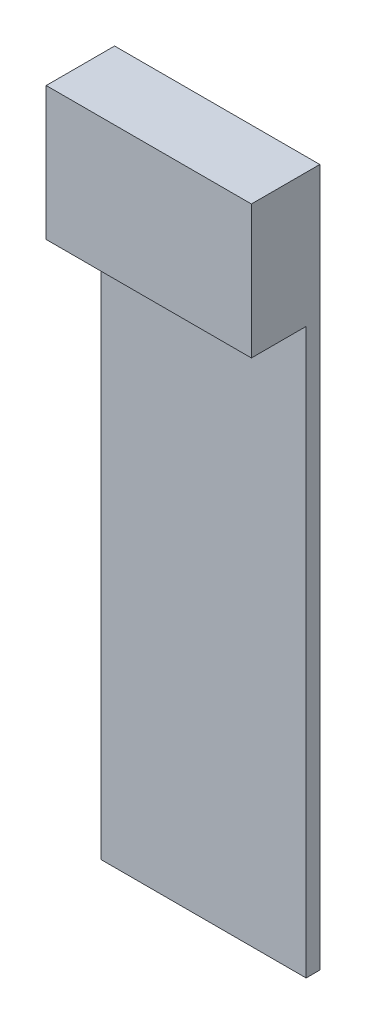
ISO-10303-21;
HEADER;
FILE_DESCRIPTION(('STEP AP214'),'2;1');
FILE_NAME('part.step','',(''),(''),'','','');
FILE_SCHEMA(('AUTOMOTIVE_DESIGN { 1 0 10303 214 1 1 1 1 }'));
ENDSEC;
DATA;
#1=APPLICATION_CONTEXT('core data for automotive mechanical design processes');
#2=APPLICATION_PROTOCOL_DEFINITION('international standard','automotive_design',2000,#1);
#3=PRODUCT_CONTEXT('',#1,'mechanical');
#4=PRODUCT('Part','Part','',(#3));
#5=PRODUCT_RELATED_PRODUCT_CATEGORY('part','',(#4));
#6=PRODUCT_DEFINITION_FORMATION('','',#4);
#7=PRODUCT_DEFINITION_CONTEXT('part definition',#1,'design');
#8=PRODUCT_DEFINITION('design','',#6,#7);
#9=PRODUCT_DEFINITION_SHAPE('','',#8);
#10=(LENGTH_UNIT() NAMED_UNIT(*) SI_UNIT(.MILLI.,.METRE.));
#11=(NAMED_UNIT(*) PLANE_ANGLE_UNIT() SI_UNIT($,.RADIAN.));
#12=(NAMED_UNIT(*) SI_UNIT($,.STERADIAN.) SOLID_ANGLE_UNIT());
#13=UNCERTAINTY_MEASURE_WITH_UNIT(LENGTH_MEASURE(1.E-05),#10,'distance_accuracy_value','');
#14=(GEOMETRIC_REPRESENTATION_CONTEXT(3) GLOBAL_UNCERTAINTY_ASSIGNED_CONTEXT((#13)) GLOBAL_UNIT_ASSIGNED_CONTEXT((#10,
#11,#12)) REPRESENTATION_CONTEXT('',''));
#15=CARTESIAN_POINT('',(0.,0.,0.));
#16=DIRECTION('',(0.,0.,1.));
#17=DIRECTION('',(1.,0.,0.));
#18=AXIS2_PLACEMENT_3D('',#15,#16,#17);
#19=CARTESIAN_POINT('',(26.3998,-5.61122,1.15316));
#20=DIRECTION('',(0.,0.,-1.));
#21=DIRECTION('',(-1.,0.,0.));
#22=AXIS2_PLACEMENT_3D('',#19,#20,#21);
#23=PLANE('',#22);
#24=DIRECTION('',(1.,0.,0.));
#25=VECTOR('',#24,1.);
#26=CARTESIAN_POINT('',(26.3998,-5.11592,1.15316));
#27=LINE('',#26,#25);
#28=CARTESIAN_POINT('',(25.6378,-5.11592,1.15316));
#29=VERTEX_POINT('',#28);
#30=CARTESIAN_POINT('',(26.3998,-5.11592,1.15316));
#31=VERTEX_POINT('',#30);
#32=EDGE_CURVE('E87',#29,#31,#27,.T.);
#33=ORIENTED_EDGE('',*,*,#32,.F.);
#34=DIRECTION('',(0.,1.,0.));
#35=VECTOR('',#34,1.);
#36=CARTESIAN_POINT('',(25.6378,-5.61122,1.15316));
#37=LINE('',#36,#35);
#38=CARTESIAN_POINT('',(25.6378,-5.61122,1.15316));
#39=VERTEX_POINT('',#38);
#40=EDGE_CURVE('E90',#39,#29,#37,.T.);
#41=ORIENTED_EDGE('',*,*,#40,.F.);
#42=DIRECTION('',(1.,0.,0.));
#43=VECTOR('',#42,1.);
#44=CARTESIAN_POINT('',(25.6378,-5.61122,1.15316));
#45=LINE('',#44,#43);
#46=CARTESIAN_POINT('',(26.3998,-5.61122,1.15316));
#47=VERTEX_POINT('',#46);
#48=EDGE_CURVE('E11',#39,#47,#45,.T.);
#49=ORIENTED_EDGE('',*,*,#48,.T.);
#50=DIRECTION('',(0.,1.,0.));
#51=VECTOR('',#50,1.);
#52=CARTESIAN_POINT('',(26.3998,-5.61122,1.15316));
#53=LINE('',#52,#51);
#54=EDGE_CURVE('E93',#47,#31,#53,.T.);
#55=ORIENTED_EDGE('',*,*,#54,.T.);
#56=EDGE_LOOP('',(#33,#41,#49,#55));
#57=FACE_BOUND('',#56,.T.);
#58=ADVANCED_FACE('F16',(#57),#23,.F.);
#59=CARTESIAN_POINT('',(26.3998,-5.61122,0.94996));
#60=DIRECTION('',(0.,1.,0.));
#61=DIRECTION('',(0.,0.,1.));
#62=AXIS2_PLACEMENT_3D('',#59,#60,#61);
#63=PLANE('',#62);
#64=DIRECTION('',(-1.,0.,0.));
#65=VECTOR('',#64,1.);
#66=CARTESIAN_POINT('',(26.3998,-5.61122,0.94996));
#67=LINE('',#66,#65);
#68=CARTESIAN_POINT('',(26.3998,-5.61122,0.94996));
#69=VERTEX_POINT('',#68);
#70=CARTESIAN_POINT('',(25.6378,-5.61122,0.94996));
#71=VERTEX_POINT('',#70);
#72=EDGE_CURVE('E27',#69,#71,#67,.T.);
#73=ORIENTED_EDGE('',*,*,#72,.F.);
#74=DIRECTION('',(0.,0.,-1.));
#75=VECTOR('',#74,1.);
#76=CARTESIAN_POINT('',(26.3998,-5.61122,1.15316));
#77=LINE('',#76,#75);
#78=EDGE_CURVE('E135',#47,#69,#77,.T.);
#79=ORIENTED_EDGE('',*,*,#78,.F.);
#80=ORIENTED_EDGE('',*,*,#48,.F.);
#81=DIRECTION('',(0.,0.,1.));
#82=VECTOR('',#81,1.);
#83=CARTESIAN_POINT('',(25.6378,-5.61122,0.94996));
#84=LINE('',#83,#82);
#85=EDGE_CURVE('E114',#71,#39,#84,.T.);
#86=ORIENTED_EDGE('',*,*,#85,.F.);
#87=EDGE_LOOP('',(#73,#79,#80,#86));
#88=FACE_BOUND('',#87,.T.);
#89=ADVANCED_FACE('F193',(#88),#63,.F.);
#90=CARTESIAN_POINT('',(26.3998,-7.70672,0.94996));
#91=DIRECTION('',(0.,0.,-1.));
#92=DIRECTION('',(-1.,0.,0.));
#93=AXIS2_PLACEMENT_3D('',#90,#91,#92);
#94=PLANE('',#93);
#95=DIRECTION('',(-1.,0.,0.));
#96=VECTOR('',#95,1.);
#97=CARTESIAN_POINT('',(25.6378,-7.70672,0.94996));
#98=LINE('',#97,#96);
#99=CARTESIAN_POINT('',(26.3998,-7.70672,0.94996));
#100=VERTEX_POINT('',#99);
#101=CARTESIAN_POINT('',(25.6378,-7.70672,0.94996));
#102=VERTEX_POINT('',#101);
#103=EDGE_CURVE('E98',#100,#102,#98,.T.);
#104=ORIENTED_EDGE('',*,*,#103,.F.);
#105=DIRECTION('',(0.,-1.,0.));
#106=VECTOR('',#105,1.);
#107=CARTESIAN_POINT('',(26.3998,-7.70672,0.94996));
#108=LINE('',#107,#106);
#109=EDGE_CURVE('E78',#69,#100,#108,.T.);
#110=ORIENTED_EDGE('',*,*,#109,.F.);
#111=ORIENTED_EDGE('',*,*,#72,.T.);
#112=DIRECTION('',(0.,1.,0.));
#113=VECTOR('',#112,1.);
#114=CARTESIAN_POINT('',(25.6378,-7.70672,0.94996));
#115=LINE('',#114,#113);
#116=EDGE_CURVE('E122',#102,#71,#115,.T.);
#117=ORIENTED_EDGE('',*,*,#116,.F.);
#118=EDGE_LOOP('',(#104,#110,#111,#117));
#119=FACE_BOUND('',#118,.T.);
#120=ADVANCED_FACE('F205',(#119),#94,.F.);
#121=CARTESIAN_POINT('',(26.3998,-5.11592,0.89916));
#122=DIRECTION('',(-1.,0.,0.));
#123=DIRECTION('',(0.,0.,-1.));
#124=AXIS2_PLACEMENT_3D('',#121,#122,#123);
#125=PLANE('',#124);
#126=DIRECTION('',(0.,-1.,0.));
#127=VECTOR('',#126,1.);
#128=CARTESIAN_POINT('',(26.3998,-5.11592,0.89916));
#129=LINE('',#128,#127);
#130=CARTESIAN_POINT('',(26.3998,-5.11592,0.89916));
#131=VERTEX_POINT('',#130);
#132=CARTESIAN_POINT('',(26.3998,-7.70672,0.89916));
#133=VERTEX_POINT('',#132);
#134=EDGE_CURVE('E129',#131,#133,#129,.T.);
#135=ORIENTED_EDGE('',*,*,#134,.F.);
#136=DIRECTION('',(0.,0.,-1.));
#137=VECTOR('',#136,1.);
#138=CARTESIAN_POINT('',(26.3998,-5.11592,1.15316));
#139=LINE('',#138,#137);
#140=EDGE_CURVE('E97',#31,#131,#139,.T.);
#141=ORIENTED_EDGE('',*,*,#140,.F.);
#142=ORIENTED_EDGE('',*,*,#54,.F.);
#143=ORIENTED_EDGE('',*,*,#78,.T.);
#144=ORIENTED_EDGE('',*,*,#109,.T.);
#145=DIRECTION('',(0.,0.,-1.));
#146=VECTOR('',#145,1.);
#147=CARTESIAN_POINT('',(26.3998,-7.70672,0.89916));
#148=LINE('',#147,#146);
#149=EDGE_CURVE('E109',#100,#133,#148,.T.);
#150=ORIENTED_EDGE('',*,*,#149,.T.);
#151=EDGE_LOOP('',(#135,#141,#142,#143,#144,#150));
#152=FACE_BOUND('',#151,.T.);
#153=ADVANCED_FACE('F217',(#152),#125,.F.);
#154=CARTESIAN_POINT('',(25.6378,-5.11592,1.15316));
#155=DIRECTION('',(0.,-1.,0.));
#156=DIRECTION('',(1.,0.,0.));
#157=AXIS2_PLACEMENT_3D('',#154,#155,#156);
#158=PLANE('',#157);
#159=DIRECTION('',(0.,0.,1.));
#160=VECTOR('',#159,1.);
#161=CARTESIAN_POINT('',(25.6378,-5.11592,1.15316));
#162=LINE('',#161,#160);
#163=CARTESIAN_POINT('',(25.6378,-5.11592,0.89916));
#164=VERTEX_POINT('',#163);
#165=EDGE_CURVE('E101',#164,#29,#162,.T.);
#166=ORIENTED_EDGE('',*,*,#165,.T.);
#167=ORIENTED_EDGE('',*,*,#32,.T.);
#168=ORIENTED_EDGE('',*,*,#140,.T.);
#169=DIRECTION('',(1.,0.,0.));
#170=VECTOR('',#169,1.);
#171=CARTESIAN_POINT('',(25.6378,-5.11592,0.89916));
#172=LINE('',#171,#170);
#173=EDGE_CURVE('E104',#164,#131,#172,.T.);
#174=ORIENTED_EDGE('',*,*,#173,.F.);
#175=EDGE_LOOP('',(#166,#167,#168,#174));
#176=FACE_BOUND('',#175,.T.);
#177=ADVANCED_FACE('F102',(#176),#158,.F.);
#178=CARTESIAN_POINT('',(26.3998,-7.70672,0.94996));
#179=DIRECTION('',(0.,1.,0.));
#180=DIRECTION('',(0.,0.,1.));
#181=AXIS2_PLACEMENT_3D('',#178,#179,#180);
#182=PLANE('',#181);
#183=ORIENTED_EDGE('',*,*,#149,.F.);
#184=ORIENTED_EDGE('',*,*,#103,.T.);
#185=DIRECTION('',(0.,0.,1.));
#186=VECTOR('',#185,1.);
#187=CARTESIAN_POINT('',(25.6378,-7.70672,0.89916));
#188=LINE('',#187,#186);
#189=CARTESIAN_POINT('',(25.6378,-7.70672,0.89916));
#190=VERTEX_POINT('',#189);
#191=EDGE_CURVE('E20',#190,#102,#188,.T.);
#192=ORIENTED_EDGE('',*,*,#191,.F.);
#193=DIRECTION('',(-1.,0.,0.));
#194=VECTOR('',#193,1.);
#195=CARTESIAN_POINT('',(25.6378,-7.70672,0.89916));
#196=LINE('',#195,#194);
#197=EDGE_CURVE('E138',#133,#190,#196,.T.);
#198=ORIENTED_EDGE('',*,*,#197,.F.);
#199=EDGE_LOOP('',(#183,#184,#192,#198));
#200=FACE_BOUND('',#199,.T.);
#201=ADVANCED_FACE('F18',(#200),#182,.F.);
#202=CARTESIAN_POINT('',(25.6378,-5.11592,0.89916));
#203=DIRECTION('',(1.,0.,0.));
#204=DIRECTION('',(0.,-1.,0.));
#205=AXIS2_PLACEMENT_3D('',#202,#203,#204);
#206=PLANE('',#205);
#207=ORIENTED_EDGE('',*,*,#191,.T.);
#208=ORIENTED_EDGE('',*,*,#116,.T.);
#209=ORIENTED_EDGE('',*,*,#85,.T.);
#210=ORIENTED_EDGE('',*,*,#40,.T.);
#211=ORIENTED_EDGE('',*,*,#165,.F.);
#212=DIRECTION('',(0.,1.,0.));
#213=VECTOR('',#212,1.);
#214=CARTESIAN_POINT('',(25.6378,-7.70672,0.89916));
#215=LINE('',#214,#213);
#216=EDGE_CURVE('E142',#190,#164,#215,.T.);
#217=ORIENTED_EDGE('',*,*,#216,.F.);
#218=EDGE_LOOP('',(#207,#208,#209,#210,#211,#217));
#219=FACE_BOUND('',#218,.T.);
#220=ADVANCED_FACE('F112',(#219),#206,.F.);
#221=CARTESIAN_POINT('',(25.6378,-7.70672,0.89916));
#222=DIRECTION('',(0.,0.,1.));
#223=DIRECTION('',(0.,-1.,0.));
#224=AXIS2_PLACEMENT_3D('',#221,#222,#223);
#225=PLANE('',#224);
#226=ORIENTED_EDGE('',*,*,#197,.T.);
#227=ORIENTED_EDGE('',*,*,#216,.T.);
#228=ORIENTED_EDGE('',*,*,#173,.T.);
#229=ORIENTED_EDGE('',*,*,#134,.T.);
#230=EDGE_LOOP('',(#226,#227,#228,#229));
#231=FACE_BOUND('',#230,.T.);
#232=ADVANCED_FACE('F175',(#231),#225,.F.);
#233=CLOSED_SHELL('',(#58,#89,#120,#153,#177,#201,#220,#232));
#234=MANIFOLD_SOLID_BREP('B1',#233);
#235=ADVANCED_BREP_SHAPE_REPRESENTATION('',(#18,#234),#14);
#236=SHAPE_DEFINITION_REPRESENTATION(#9,#235);
ENDSEC;
END-ISO-10303-21;
